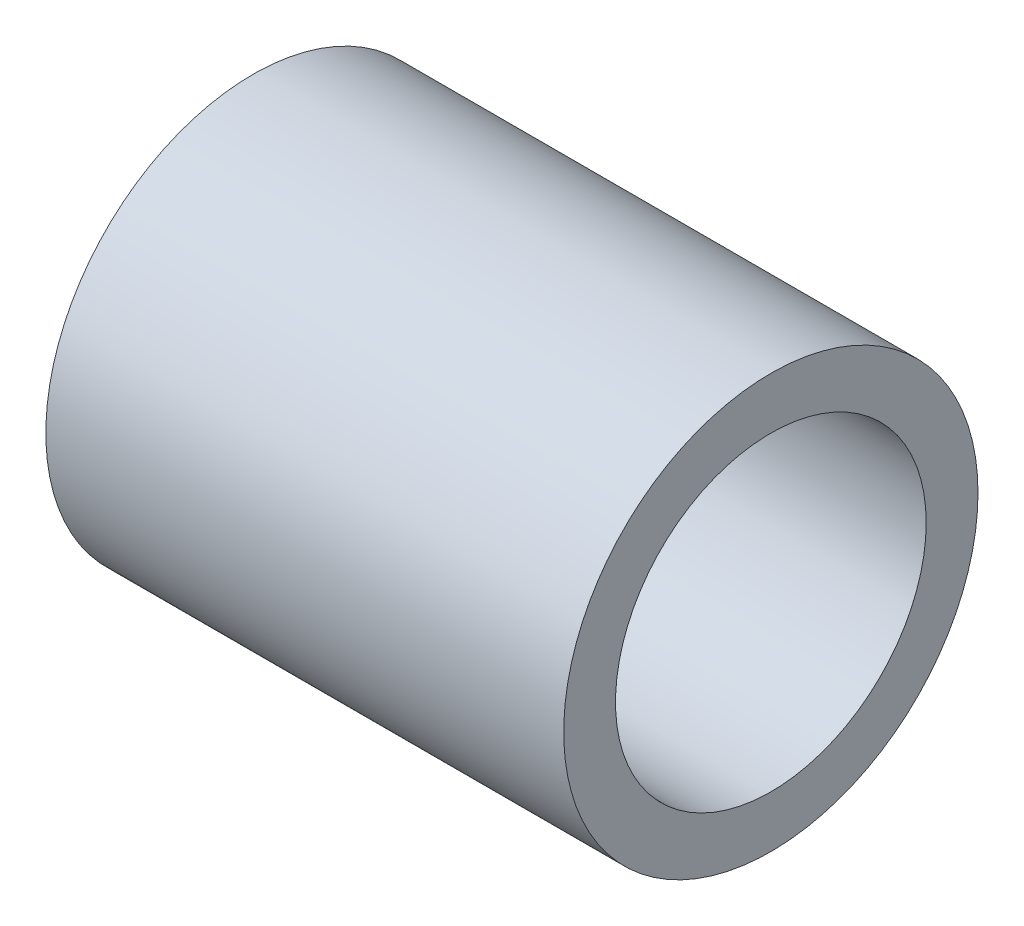
ISO-10303-21;
HEADER;
FILE_DESCRIPTION(('STEP AP214'),'2;1');
FILE_NAME('part.step','',(''),(''),'','','');
FILE_SCHEMA(('AUTOMOTIVE_DESIGN { 1 0 10303 214 1 1 1 1 }'));
ENDSEC;
DATA;
#1=APPLICATION_CONTEXT('core data for automotive mechanical design processes');
#2=APPLICATION_PROTOCOL_DEFINITION('international standard','automotive_design',2000,#1);
#3=PRODUCT_CONTEXT('',#1,'mechanical');
#4=PRODUCT('Part','Part','',(#3));
#5=PRODUCT_RELATED_PRODUCT_CATEGORY('part','',(#4));
#6=PRODUCT_DEFINITION_FORMATION('','',#4);
#7=PRODUCT_DEFINITION_CONTEXT('part definition',#1,'design');
#8=PRODUCT_DEFINITION('design','',#6,#7);
#9=PRODUCT_DEFINITION_SHAPE('','',#8);
#10=(LENGTH_UNIT() NAMED_UNIT(*) SI_UNIT(.MILLI.,.METRE.));
#11=(NAMED_UNIT(*) PLANE_ANGLE_UNIT() SI_UNIT($,.RADIAN.));
#12=(NAMED_UNIT(*) SI_UNIT($,.STERADIAN.) SOLID_ANGLE_UNIT());
#13=UNCERTAINTY_MEASURE_WITH_UNIT(LENGTH_MEASURE(1.E-05),#10,'distance_accuracy_value','');
#14=(GEOMETRIC_REPRESENTATION_CONTEXT(3) GLOBAL_UNCERTAINTY_ASSIGNED_CONTEXT((#13)) GLOBAL_UNIT_ASSIGNED_CONTEXT((#10,
#11,#12)) REPRESENTATION_CONTEXT('',''));
#15=CARTESIAN_POINT('',(0.,0.,0.));
#16=DIRECTION('',(0.,0.,1.));
#17=DIRECTION('',(1.,0.,0.));
#18=AXIS2_PLACEMENT_3D('',#15,#16,#17);
#19=CARTESIAN_POINT('',(541.,300.,157.));
#20=DIRECTION('',(-1.,0.,0.));
#21=DIRECTION('',(0.,0.,1.));
#22=AXIS2_PLACEMENT_3D('',#19,#20,#21);
#23=CYLINDRICAL_SURFACE('',#22,8.00000000000001);
#24=CARTESIAN_POINT('',(541.,300.,157.));
#25=DIRECTION('',(1.,0.,0.));
#26=DIRECTION('',(0.,0.,-1.));
#27=AXIS2_PLACEMENT_3D('',#24,#25,#26);
#28=CIRCLE('',#27,8.00000000000001);
#29=CARTESIAN_POINT('',(541.,300.,149.));
#30=VERTEX_POINT('',#29);
#31=EDGE_CURVE('E10',#30,#30,#28,.T.);
#32=ORIENTED_EDGE('',*,*,#31,.F.);
#33=EDGE_LOOP('',(#32));
#34=FACE_BOUND('',#33,.T.);
#35=CARTESIAN_POINT('',(521.,300.,157.));
#36=DIRECTION('',(1.,0.,0.));
#37=DIRECTION('',(0.,0.,-1.));
#38=AXIS2_PLACEMENT_3D('',#35,#36,#37);
#39=CIRCLE('',#38,8.00000000000001);
#40=CARTESIAN_POINT('',(521.,300.,149.));
#41=VERTEX_POINT('',#40);
#42=EDGE_CURVE('E42',#41,#41,#39,.T.);
#43=ORIENTED_EDGE('',*,*,#42,.T.);
#44=EDGE_LOOP('',(#43));
#45=FACE_BOUND('',#44,.T.);
#46=ADVANCED_FACE('F40',(#34,#45),#23,.T.);
#47=CARTESIAN_POINT('',(541.,300.,157.));
#48=DIRECTION('',(1.,0.,0.));
#49=DIRECTION('',(0.,0.,-1.));
#50=AXIS2_PLACEMENT_3D('',#47,#48,#49);
#51=PLANE('',#50);
#52=CARTESIAN_POINT('',(541.,300.,157.));
#53=DIRECTION('',(1.,0.,0.));
#54=DIRECTION('',(0.,0.,-1.));
#55=AXIS2_PLACEMENT_3D('',#52,#53,#54);
#56=CIRCLE('',#55,6.00000000000002);
#57=CARTESIAN_POINT('',(541.,300.,151.));
#58=VERTEX_POINT('',#57);
#59=EDGE_CURVE('E49',#58,#58,#56,.T.);
#60=ORIENTED_EDGE('',*,*,#59,.F.);
#61=EDGE_LOOP('',(#60));
#62=FACE_BOUND('',#61,.T.);
#63=ORIENTED_EDGE('',*,*,#31,.T.);
#64=EDGE_LOOP('',(#63));
#65=FACE_BOUND('',#64,.T.);
#66=ADVANCED_FACE('F67',(#62,#65),#51,.T.);
#67=CARTESIAN_POINT('',(521.,300.,157.));
#68=DIRECTION('',(1.,0.,0.));
#69=DIRECTION('',(0.,0.,-1.));
#70=AXIS2_PLACEMENT_3D('',#67,#68,#69);
#71=PLANE('',#70);
#72=CARTESIAN_POINT('',(521.,300.,157.));
#73=DIRECTION('',(1.,0.,0.));
#74=DIRECTION('',(0.,0.,-1.));
#75=AXIS2_PLACEMENT_3D('',#72,#73,#74);
#76=CIRCLE('',#75,6.00000000000002);
#77=CARTESIAN_POINT('',(521.,300.,151.));
#78=VERTEX_POINT('',#77);
#79=EDGE_CURVE('E37',#78,#78,#76,.T.);
#80=ORIENTED_EDGE('',*,*,#79,.T.);
#81=EDGE_LOOP('',(#80));
#82=FACE_BOUND('',#81,.T.);
#83=ORIENTED_EDGE('',*,*,#42,.F.);
#84=EDGE_LOOP('',(#83));
#85=FACE_BOUND('',#84,.T.);
#86=ADVANCED_FACE('F60',(#82,#85),#71,.F.);
#87=CARTESIAN_POINT('',(501.,300.,157.));
#88=DIRECTION('',(1.,0.,0.));
#89=DIRECTION('',(0.,0.,-1.));
#90=AXIS2_PLACEMENT_3D('',#87,#88,#89);
#91=CYLINDRICAL_SURFACE('',#90,6.00000000000002);
#92=CARTESIAN_POINT('',(541.,300.,151.));
#93=CARTESIAN_POINT('',(540.791666666667,300.,151.));
#94=CARTESIAN_POINT('',(540.583333333333,300.,151.));
#95=CARTESIAN_POINT('',(540.166666666667,300.,151.));
#96=CARTESIAN_POINT('',(539.958333333333,300.,151.));
#97=CARTESIAN_POINT('',(539.541666666667,300.,151.));
#98=CARTESIAN_POINT('',(539.333333333333,300.,151.));
#99=CARTESIAN_POINT('',(538.916666666667,300.,151.));
#100=CARTESIAN_POINT('',(538.708333333333,300.,151.));
#101=CARTESIAN_POINT('',(538.291666666667,300.,151.));
#102=CARTESIAN_POINT('',(538.083333333333,300.,151.));
#103=CARTESIAN_POINT('',(537.666666666667,300.,151.));
#104=CARTESIAN_POINT('',(537.458333333333,300.,151.));
#105=CARTESIAN_POINT('',(537.041666666667,300.,151.));
#106=CARTESIAN_POINT('',(536.833333333333,300.,151.));
#107=CARTESIAN_POINT('',(536.416666666667,300.,151.));
#108=CARTESIAN_POINT('',(536.208333333333,300.,151.));
#109=CARTESIAN_POINT('',(535.791666666667,300.,151.));
#110=CARTESIAN_POINT('',(535.583333333333,300.,151.));
#111=CARTESIAN_POINT('',(535.166666666667,300.,151.));
#112=CARTESIAN_POINT('',(534.958333333333,300.,151.));
#113=CARTESIAN_POINT('',(534.541666666667,300.,151.));
#114=CARTESIAN_POINT('',(534.333333333333,300.,151.));
#115=CARTESIAN_POINT('',(533.916666666667,300.,151.));
#116=CARTESIAN_POINT('',(533.708333333333,300.,151.));
#117=CARTESIAN_POINT('',(533.291666666667,300.,151.));
#118=CARTESIAN_POINT('',(533.083333333333,300.,151.));
#119=CARTESIAN_POINT('',(532.666666666667,300.,151.));
#120=CARTESIAN_POINT('',(532.458333333333,300.,151.));
#121=CARTESIAN_POINT('',(532.041666666667,300.,151.));
#122=CARTESIAN_POINT('',(531.833333333333,300.,151.));
#123=CARTESIAN_POINT('',(531.416666666667,300.,151.));
#124=CARTESIAN_POINT('',(531.208333333333,300.,151.));
#125=CARTESIAN_POINT('',(530.791666666667,300.,151.));
#126=CARTESIAN_POINT('',(530.583333333333,300.,151.));
#127=CARTESIAN_POINT('',(530.166666666667,300.,151.));
#128=CARTESIAN_POINT('',(529.958333333333,300.,151.));
#129=CARTESIAN_POINT('',(529.541666666667,300.,151.));
#130=CARTESIAN_POINT('',(529.333333333333,300.,151.));
#131=CARTESIAN_POINT('',(528.916666666667,300.,151.));
#132=CARTESIAN_POINT('',(528.708333333333,300.,151.));
#133=CARTESIAN_POINT('',(528.291666666667,300.,151.));
#134=CARTESIAN_POINT('',(528.083333333333,300.,151.));
#135=CARTESIAN_POINT('',(527.666666666667,300.,151.));
#136=CARTESIAN_POINT('',(527.458333333333,300.,151.));
#137=CARTESIAN_POINT('',(527.041666666667,300.,151.));
#138=CARTESIAN_POINT('',(526.833333333333,300.,151.));
#139=CARTESIAN_POINT('',(526.416666666667,300.,151.));
#140=CARTESIAN_POINT('',(526.208333333333,300.,151.));
#141=CARTESIAN_POINT('',(525.791666666667,300.,151.));
#142=CARTESIAN_POINT('',(525.583333333333,300.,151.));
#143=CARTESIAN_POINT('',(525.166666666667,300.,151.));
#144=CARTESIAN_POINT('',(524.958333333333,300.,151.));
#145=CARTESIAN_POINT('',(524.541666666667,300.,151.));
#146=CARTESIAN_POINT('',(524.333333333333,300.,151.));
#147=CARTESIAN_POINT('',(523.916666666667,300.,151.));
#148=CARTESIAN_POINT('',(523.708333333333,300.,151.));
#149=CARTESIAN_POINT('',(523.291666666667,300.,151.));
#150=CARTESIAN_POINT('',(523.083333333333,300.,151.));
#151=CARTESIAN_POINT('',(522.666666666667,300.,151.));
#152=CARTESIAN_POINT('',(522.458333333333,300.,151.));
#153=CARTESIAN_POINT('',(522.041666666667,300.,151.));
#154=CARTESIAN_POINT('',(521.833333333333,300.,151.));
#155=CARTESIAN_POINT('',(521.416666666667,300.,151.));
#156=CARTESIAN_POINT('',(521.208333333333,300.,151.));
#157=CARTESIAN_POINT('',(521.,300.,151.));
#158=B_SPLINE_CURVE_WITH_KNOTS('',3,(#92,#93,#94,#95,#96,#97,#98,#99,#100,#101,#102,#103,#104,
#105,#106,#107,#108,#109,#110,#111,#112,#113,#114,#115,#116,#117,#118,#119,#120,#121,#122,#123,
#124,#125,#126,#127,#128,#129,#130,#131,#132,#133,#134,#135,#136,#137,#138,#139,#140,#141,#142,
#143,#144,#145,#146,#147,#148,#149,#150,#151,#152,#153,#154,#155,#156,#157),.UNSPECIFIED.,.F.,
.F.,(4,2,2,2,2,2,2,2,2,2,2,2,2,2,2,2,2,2,2,2,2,2,2,2,2,2,2,2,2,2,2,2,4),(0.,0.625000000000098,
1.25000000000008,1.87500000000007,2.50000000000006,3.12500000000004,3.75000000000003,
4.37500000000002,5.,5.6250000000001,6.25000000000009,6.87500000000008,7.50000000000006,
8.12500000000005,8.75000000000004,9.37500000000002,10.,10.6250000000001,11.2500000000001,
11.8750000000001,12.5000000000001,13.1250000000001,13.75,14.375,15.,15.6250000000001,
16.2500000000001,16.8750000000001,17.5000000000001,18.1250000000001,18.75,19.375,20.),.UNSPECIFIED.);
#159=EDGE_CURVE('BSEAM58',#58,#78,#158,.T.);
#160=ORIENTED_EDGE('',*,*,#59,.T.);
#161=ORIENTED_EDGE('',*,*,#79,.F.);
#162=ORIENTED_EDGE('',*,*,#159,.T.);
#163=ORIENTED_EDGE('',*,*,#159,.F.);
#164=EDGE_LOOP('',(#160,#162,#161,#163));
#165=FACE_BOUND('',#164,.T.);
#166=ADVANCED_FACE('F58',(#165),#91,.F.);
#167=CLOSED_SHELL('',(#46,#66,#86,#166));
#168=MANIFOLD_SOLID_BREP('B2',#167);
#169=ADVANCED_BREP_SHAPE_REPRESENTATION('',(#18,#168),#14);
#170=SHAPE_DEFINITION_REPRESENTATION(#9,#169);
ENDSEC;
END-ISO-10303-21;
